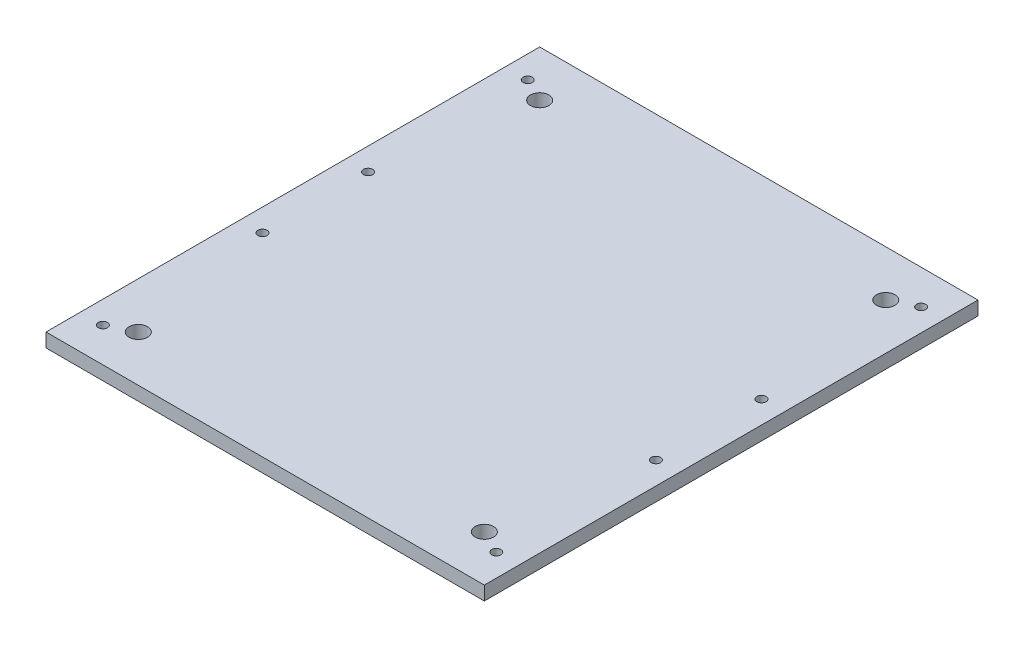
ISO-10303-21;
HEADER;
FILE_DESCRIPTION(('STEP AP214'),'2;1');
FILE_NAME('part.step','',(''),(''),'','','');
FILE_SCHEMA(('AUTOMOTIVE_DESIGN { 1 0 10303 214 1 1 1 1 }'));
ENDSEC;
DATA;
#1=APPLICATION_CONTEXT('core data for automotive mechanical design processes');
#2=APPLICATION_PROTOCOL_DEFINITION('international standard','automotive_design',2000,#1);
#3=PRODUCT_CONTEXT('',#1,'mechanical');
#4=PRODUCT('Part','Part','',(#3));
#5=PRODUCT_RELATED_PRODUCT_CATEGORY('part','',(#4));
#6=PRODUCT_DEFINITION_FORMATION('','',#4);
#7=PRODUCT_DEFINITION_CONTEXT('part definition',#1,'design');
#8=PRODUCT_DEFINITION('design','',#6,#7);
#9=PRODUCT_DEFINITION_SHAPE('','',#8);
#10=(LENGTH_UNIT() NAMED_UNIT(*) SI_UNIT(.MILLI.,.METRE.));
#11=(NAMED_UNIT(*) PLANE_ANGLE_UNIT() SI_UNIT($,.RADIAN.));
#12=(NAMED_UNIT(*) SI_UNIT($,.STERADIAN.) SOLID_ANGLE_UNIT());
#13=UNCERTAINTY_MEASURE_WITH_UNIT(LENGTH_MEASURE(1.E-05),#10,'distance_accuracy_value','');
#14=(GEOMETRIC_REPRESENTATION_CONTEXT(3) GLOBAL_UNCERTAINTY_ASSIGNED_CONTEXT((#13)) GLOBAL_UNIT_ASSIGNED_CONTEXT((#10,
#11,#12)) REPRESENTATION_CONTEXT('',''));
#15=CARTESIAN_POINT('',(0.,0.,0.));
#16=DIRECTION('',(0.,0.,1.));
#17=DIRECTION('',(1.,0.,0.));
#18=AXIS2_PLACEMENT_3D('',#15,#16,#17);
#19=CARTESIAN_POINT('',(0.,3.,53.5));
#20=DIRECTION('',(0.,0.,-1.));
#21=DIRECTION('',(-1.,0.,0.));
#22=AXIS2_PLACEMENT_3D('',#19,#20,#21);
#23=PLANE('',#22);
#24=DIRECTION('',(1.,0.,0.));
#25=VECTOR('',#24,1.);
#26=CARTESIAN_POINT('',(0.,0.,53.5));
#27=LINE('',#26,#25);
#28=CARTESIAN_POINT('',(-47.5,0.,53.5));
#29=VERTEX_POINT('',#28);
#30=CARTESIAN_POINT('',(47.5,0.,53.5));
#31=VERTEX_POINT('',#30);
#32=EDGE_CURVE('E132',#29,#31,#27,.T.);
#33=ORIENTED_EDGE('',*,*,#32,.T.);
#34=DIRECTION('',(0.,-1.,0.));
#35=VECTOR('',#34,1.);
#36=CARTESIAN_POINT('',(47.5,3.,53.5));
#37=LINE('',#36,#35);
#38=CARTESIAN_POINT('',(47.5,3.,53.5));
#39=VERTEX_POINT('',#38);
#40=EDGE_CURVE('E13',#39,#31,#37,.T.);
#41=ORIENTED_EDGE('',*,*,#40,.F.);
#42=DIRECTION('',(1.,0.,0.));
#43=VECTOR('',#42,1.);
#44=CARTESIAN_POINT('',(0.,3.,53.5));
#45=LINE('',#44,#43);
#46=CARTESIAN_POINT('',(-47.5,3.,53.5));
#47=VERTEX_POINT('',#46);
#48=EDGE_CURVE('E105',#47,#39,#45,.T.);
#49=ORIENTED_EDGE('',*,*,#48,.F.);
#50=DIRECTION('',(0.,-1.,0.));
#51=VECTOR('',#50,1.);
#52=CARTESIAN_POINT('',(-47.5,3.,53.5));
#53=LINE('',#52,#51);
#54=EDGE_CURVE('E71',#47,#29,#53,.T.);
#55=ORIENTED_EDGE('',*,*,#54,.T.);
#56=EDGE_LOOP('',(#33,#41,#49,#55));
#57=FACE_BOUND('',#56,.T.);
#58=ADVANCED_FACE('F53',(#57),#23,.F.);
#59=CARTESIAN_POINT('',(47.5,3.,0.));
#60=DIRECTION('',(-1.,0.,0.));
#61=DIRECTION('',(0.,0.,1.));
#62=AXIS2_PLACEMENT_3D('',#59,#60,#61);
#63=PLANE('',#62);
#64=DIRECTION('',(0.,0.,-1.));
#65=VECTOR('',#64,1.);
#66=CARTESIAN_POINT('',(47.5,0.,0.));
#67=LINE('',#66,#65);
#68=CARTESIAN_POINT('',(47.5,0.,-53.5));
#69=VERTEX_POINT('',#68);
#70=EDGE_CURVE('E110',#31,#69,#67,.T.);
#71=ORIENTED_EDGE('',*,*,#70,.T.);
#72=DIRECTION('',(0.,-1.,0.));
#73=VECTOR('',#72,1.);
#74=CARTESIAN_POINT('',(47.5,3.,-53.5));
#75=LINE('',#74,#73);
#76=CARTESIAN_POINT('',(47.5,3.,-53.5));
#77=VERTEX_POINT('',#76);
#78=EDGE_CURVE('E62',#77,#69,#75,.T.);
#79=ORIENTED_EDGE('',*,*,#78,.F.);
#80=DIRECTION('',(0.,0.,-1.));
#81=VECTOR('',#80,1.);
#82=CARTESIAN_POINT('',(47.5,3.,0.));
#83=LINE('',#82,#81);
#84=EDGE_CURVE('E96',#39,#77,#83,.T.);
#85=ORIENTED_EDGE('',*,*,#84,.F.);
#86=ORIENTED_EDGE('',*,*,#40,.T.);
#87=EDGE_LOOP('',(#71,#79,#85,#86));
#88=FACE_BOUND('',#87,.T.);
#89=ADVANCED_FACE('F109',(#88),#63,.F.);
#90=CARTESIAN_POINT('',(0.,3.,-53.5));
#91=DIRECTION('',(0.,0.,-1.));
#92=DIRECTION('',(-1.,0.,0.));
#93=AXIS2_PLACEMENT_3D('',#90,#91,#92);
#94=PLANE('',#93);
#95=DIRECTION('',(1.,0.,0.));
#96=VECTOR('',#95,1.);
#97=CARTESIAN_POINT('',(0.,0.,-53.5));
#98=LINE('',#97,#96);
#99=CARTESIAN_POINT('',(-47.5,0.,-53.5));
#100=VERTEX_POINT('',#99);
#101=EDGE_CURVE('E136',#100,#69,#98,.T.);
#102=ORIENTED_EDGE('',*,*,#101,.F.);
#103=DIRECTION('',(0.,-1.,0.));
#104=VECTOR('',#103,1.);
#105=CARTESIAN_POINT('',(-47.5,3.,-53.5));
#106=LINE('',#105,#104);
#107=CARTESIAN_POINT('',(-47.5,3.,-53.5));
#108=VERTEX_POINT('',#107);
#109=EDGE_CURVE('E85',#108,#100,#106,.T.);
#110=ORIENTED_EDGE('',*,*,#109,.F.);
#111=DIRECTION('',(1.,0.,0.));
#112=VECTOR('',#111,1.);
#113=CARTESIAN_POINT('',(0.,3.,-53.5));
#114=LINE('',#113,#112);
#115=EDGE_CURVE('E104',#108,#77,#114,.T.);
#116=ORIENTED_EDGE('',*,*,#115,.T.);
#117=ORIENTED_EDGE('',*,*,#78,.T.);
#118=EDGE_LOOP('',(#102,#110,#116,#117));
#119=FACE_BOUND('',#118,.T.);
#120=ADVANCED_FACE('F114',(#119),#94,.T.);
#121=CARTESIAN_POINT('',(37.5,3.,43.5));
#122=DIRECTION('',(0.,-1.,0.));
#123=DIRECTION('',(0.,0.,-1.));
#124=AXIS2_PLACEMENT_3D('',#121,#122,#123);
#125=CYLINDRICAL_SURFACE('',#124,2.);
#126=CARTESIAN_POINT('',(37.5,3.,43.5));
#127=DIRECTION('',(0.,1.,0.));
#128=DIRECTION('',(0.,0.,1.));
#129=AXIS2_PLACEMENT_3D('',#126,#127,#128);
#130=CIRCLE('',#129,2.);
#131=CARTESIAN_POINT('',(37.5,3.,45.5));
#132=VERTEX_POINT('',#131);
#133=EDGE_CURVE('E126',#132,#132,#130,.T.);
#134=ORIENTED_EDGE('',*,*,#133,.T.);
#135=EDGE_LOOP('',(#134));
#136=FACE_BOUND('',#135,.T.);
#137=CARTESIAN_POINT('',(37.5,0.,43.5));
#138=DIRECTION('',(0.,1.,0.));
#139=DIRECTION('',(0.,0.,1.));
#140=AXIS2_PLACEMENT_3D('',#137,#138,#139);
#141=CIRCLE('',#140,2.);
#142=CARTESIAN_POINT('',(37.5,0.,45.5));
#143=VERTEX_POINT('',#142);
#144=EDGE_CURVE('E147',#143,#143,#141,.T.);
#145=ORIENTED_EDGE('',*,*,#144,.F.);
#146=EDGE_LOOP('',(#145));
#147=FACE_BOUND('',#146,.T.);
#148=ADVANCED_FACE('F241',(#136,#147),#125,.F.);
#149=CARTESIAN_POINT('',(37.5,3.,-43.5));
#150=DIRECTION('',(0.,-1.,0.));
#151=DIRECTION('',(0.,0.,-1.));
#152=AXIS2_PLACEMENT_3D('',#149,#150,#151);
#153=CYLINDRICAL_SURFACE('',#152,2.);
#154=CARTESIAN_POINT('',(37.5,3.,-43.5));
#155=DIRECTION('',(0.,1.,0.));
#156=DIRECTION('',(0.,0.,1.));
#157=AXIS2_PLACEMENT_3D('',#154,#155,#156);
#158=CIRCLE('',#157,2.);
#159=CARTESIAN_POINT('',(37.5,3.,-41.5));
#160=VERTEX_POINT('',#159);
#161=EDGE_CURVE('E123',#160,#160,#158,.F.);
#162=ORIENTED_EDGE('',*,*,#161,.F.);
#163=EDGE_LOOP('',(#162));
#164=FACE_BOUND('',#163,.T.);
#165=CARTESIAN_POINT('',(37.5,0.,-43.5));
#166=DIRECTION('',(0.,1.,0.));
#167=DIRECTION('',(0.,0.,1.));
#168=AXIS2_PLACEMENT_3D('',#165,#166,#167);
#169=CIRCLE('',#168,2.);
#170=CARTESIAN_POINT('',(37.5,0.,-41.5));
#171=VERTEX_POINT('',#170);
#172=EDGE_CURVE('E144',#171,#171,#169,.F.);
#173=ORIENTED_EDGE('',*,*,#172,.T.);
#174=EDGE_LOOP('',(#173));
#175=FACE_BOUND('',#174,.T.);
#176=ADVANCED_FACE('F235',(#164,#175),#153,.F.);
#177=CARTESIAN_POINT('',(-37.5,3.,-43.5));
#178=DIRECTION('',(0.,-1.,0.));
#179=DIRECTION('',(0.,0.,-1.));
#180=AXIS2_PLACEMENT_3D('',#177,#178,#179);
#181=CYLINDRICAL_SURFACE('',#180,2.);
#182=CARTESIAN_POINT('',(-37.5,3.,-43.5));
#183=DIRECTION('',(0.,1.,0.));
#184=DIRECTION('',(0.,0.,1.));
#185=AXIS2_PLACEMENT_3D('',#182,#183,#184);
#186=CIRCLE('',#185,2.);
#187=CARTESIAN_POINT('',(-37.5,3.,-41.5));
#188=VERTEX_POINT('',#187);
#189=EDGE_CURVE('E117',#188,#188,#186,.T.);
#190=ORIENTED_EDGE('',*,*,#189,.T.);
#191=EDGE_LOOP('',(#190));
#192=FACE_BOUND('',#191,.T.);
#193=CARTESIAN_POINT('',(-37.5,0.,-43.5));
#194=DIRECTION('',(0.,1.,0.));
#195=DIRECTION('',(0.,0.,1.));
#196=AXIS2_PLACEMENT_3D('',#193,#194,#195);
#197=CIRCLE('',#196,2.);
#198=CARTESIAN_POINT('',(-37.5,0.,-41.5));
#199=VERTEX_POINT('',#198);
#200=EDGE_CURVE('E141',#199,#199,#197,.T.);
#201=ORIENTED_EDGE('',*,*,#200,.F.);
#202=EDGE_LOOP('',(#201));
#203=FACE_BOUND('',#202,.T.);
#204=ADVANCED_FACE('F230',(#192,#203),#181,.F.);
#205=CARTESIAN_POINT('',(-47.5,3.,0.));
#206=DIRECTION('',(-1.,0.,0.));
#207=DIRECTION('',(0.,0.,1.));
#208=AXIS2_PLACEMENT_3D('',#205,#206,#207);
#209=PLANE('',#208);
#210=DIRECTION('',(0.,0.,-1.));
#211=VECTOR('',#210,1.);
#212=CARTESIAN_POINT('',(-47.5,0.,0.));
#213=LINE('',#212,#211);
#214=EDGE_CURVE('E138',#29,#100,#213,.T.);
#215=ORIENTED_EDGE('',*,*,#214,.F.);
#216=ORIENTED_EDGE('',*,*,#54,.F.);
#217=DIRECTION('',(0.,0.,-1.));
#218=VECTOR('',#217,1.);
#219=CARTESIAN_POINT('',(-47.5,3.,0.));
#220=LINE('',#219,#218);
#221=EDGE_CURVE('E115',#47,#108,#220,.T.);
#222=ORIENTED_EDGE('',*,*,#221,.T.);
#223=ORIENTED_EDGE('',*,*,#109,.T.);
#224=EDGE_LOOP('',(#215,#216,#222,#223));
#225=FACE_BOUND('',#224,.T.);
#226=ADVANCED_FACE('F217',(#225),#209,.T.);
#227=CARTESIAN_POINT('',(-37.5,3.,43.5));
#228=DIRECTION('',(0.,-1.,0.));
#229=DIRECTION('',(0.,0.,-1.));
#230=AXIS2_PLACEMENT_3D('',#227,#228,#229);
#231=CYLINDRICAL_SURFACE('',#230,2.);
#232=CARTESIAN_POINT('',(-37.5,3.,43.5));
#233=DIRECTION('',(0.,1.,0.));
#234=DIRECTION('',(0.,0.,1.));
#235=AXIS2_PLACEMENT_3D('',#232,#233,#234);
#236=CIRCLE('',#235,2.);
#237=CARTESIAN_POINT('',(-37.5,3.,45.5));
#238=VERTEX_POINT('',#237);
#239=EDGE_CURVE('E129',#238,#238,#236,.F.);
#240=ORIENTED_EDGE('',*,*,#239,.F.);
#241=EDGE_LOOP('',(#240));
#242=FACE_BOUND('',#241,.T.);
#243=CARTESIAN_POINT('',(-37.5,0.,43.5));
#244=DIRECTION('',(0.,1.,0.));
#245=DIRECTION('',(0.,0.,1.));
#246=AXIS2_PLACEMENT_3D('',#243,#244,#245);
#247=CIRCLE('',#246,2.);
#248=CARTESIAN_POINT('',(-37.5,0.,45.5));
#249=VERTEX_POINT('',#248);
#250=EDGE_CURVE('E150',#249,#249,#247,.F.);
#251=ORIENTED_EDGE('',*,*,#250,.T.);
#252=EDGE_LOOP('',(#251));
#253=FACE_BOUND('',#252,.T.);
#254=ADVANCED_FACE('F208',(#242,#253),#231,.F.);
#255=CARTESIAN_POINT('',(0.,3.,0.));
#256=DIRECTION('',(0.,1.,0.));
#257=DIRECTION('',(0.,0.,1.));
#258=AXIS2_PLACEMENT_3D('',#255,#256,#257);
#259=PLANE('',#258);
#260=CARTESIAN_POINT('',(-42.63,3.,11.4372225515878));
#261=DIRECTION('',(0.,-1.,0.));
#262=DIRECTION('',(0.,0.,1.));
#263=AXIS2_PLACEMENT_3D('',#260,#261,#262);
#264=CIRCLE('',#263,0.999999999999998);
#265=CARTESIAN_POINT('',(-42.63,3.,12.4372225515878));
#266=VERTEX_POINT('',#265);
#267=EDGE_CURVE('E189',#266,#266,#264,.T.);
#268=ORIENTED_EDGE('',*,*,#267,.T.);
#269=EDGE_LOOP('',(#268));
#270=FACE_BOUND('',#269,.T.);
#271=CARTESIAN_POINT('',(-42.63,3.,-11.4372225515878));
#272=DIRECTION('',(0.,1.,0.));
#273=DIRECTION('',(0.,0.,-1.));
#274=AXIS2_PLACEMENT_3D('',#271,#272,#273);
#275=CIRCLE('',#274,0.999999999999998);
#276=CARTESIAN_POINT('',(-42.63,3.,-12.4372225515878));
#277=VERTEX_POINT('',#276);
#278=EDGE_CURVE('E179',#277,#277,#275,.T.);
#279=ORIENTED_EDGE('',*,*,#278,.F.);
#280=EDGE_LOOP('',(#279));
#281=FACE_BOUND('',#280,.T.);
#282=CARTESIAN_POINT('',(42.63,3.,11.4372225515878));
#283=DIRECTION('',(0.,1.,0.));
#284=DIRECTION('',(0.,0.,1.));
#285=AXIS2_PLACEMENT_3D('',#282,#283,#284);
#286=CIRCLE('',#285,0.999999999999998);
#287=CARTESIAN_POINT('',(42.63,3.,12.4372225515878));
#288=VERTEX_POINT('',#287);
#289=EDGE_CURVE('E176',#288,#288,#286,.T.);
#290=ORIENTED_EDGE('',*,*,#289,.F.);
#291=EDGE_LOOP('',(#290));
#292=FACE_BOUND('',#291,.T.);
#293=CARTESIAN_POINT('',(-42.63,3.,46.04));
#294=DIRECTION('',(0.,1.,0.));
#295=DIRECTION('',(0.,0.,-1.));
#296=AXIS2_PLACEMENT_3D('',#293,#294,#295);
#297=CIRCLE('',#296,0.999999999999998);
#298=CARTESIAN_POINT('',(-42.63,3.,45.04));
#299=VERTEX_POINT('',#298);
#300=EDGE_CURVE('E173',#299,#299,#297,.T.);
#301=ORIENTED_EDGE('',*,*,#300,.F.);
#302=EDGE_LOOP('',(#301));
#303=FACE_BOUND('',#302,.T.);
#304=CARTESIAN_POINT('',(-42.63,3.,-46.04));
#305=DIRECTION('',(0.,-1.,0.));
#306=DIRECTION('',(0.,0.,1.));
#307=AXIS2_PLACEMENT_3D('',#304,#305,#306);
#308=CIRCLE('',#307,0.999999999999998);
#309=CARTESIAN_POINT('',(-42.63,3.,-45.04));
#310=VERTEX_POINT('',#309);
#311=EDGE_CURVE('E169',#310,#310,#308,.T.);
#312=ORIENTED_EDGE('',*,*,#311,.T.);
#313=EDGE_LOOP('',(#312));
#314=FACE_BOUND('',#313,.T.);
#315=CARTESIAN_POINT('',(42.63,3.,46.04));
#316=DIRECTION('',(0.,-1.,0.));
#317=DIRECTION('',(0.,0.,-1.));
#318=AXIS2_PLACEMENT_3D('',#315,#316,#317);
#319=CIRCLE('',#318,0.999999999999998);
#320=CARTESIAN_POINT('',(42.63,3.,45.04));
#321=VERTEX_POINT('',#320);
#322=EDGE_CURVE('E165',#321,#321,#319,.T.);
#323=ORIENTED_EDGE('',*,*,#322,.T.);
#324=EDGE_LOOP('',(#323));
#325=FACE_BOUND('',#324,.T.);
#326=CARTESIAN_POINT('',(42.63,3.,-11.4372225515878));
#327=DIRECTION('',(0.,-1.,0.));
#328=DIRECTION('',(0.,0.,-1.));
#329=AXIS2_PLACEMENT_3D('',#326,#327,#328);
#330=CIRCLE('',#329,0.999999999999998);
#331=CARTESIAN_POINT('',(42.63,3.,-12.4372225515878));
#332=VERTEX_POINT('',#331);
#333=EDGE_CURVE('E161',#332,#332,#330,.T.);
#334=ORIENTED_EDGE('',*,*,#333,.T.);
#335=EDGE_LOOP('',(#334));
#336=FACE_BOUND('',#335,.T.);
#337=CARTESIAN_POINT('',(42.63,3.,-46.04));
#338=DIRECTION('',(0.,1.,0.));
#339=DIRECTION('',(0.,0.,1.));
#340=AXIS2_PLACEMENT_3D('',#337,#338,#339);
#341=CIRCLE('',#340,0.999999999999998);
#342=CARTESIAN_POINT('',(42.63,3.,-45.04));
#343=VERTEX_POINT('',#342);
#344=EDGE_CURVE('E157',#343,#343,#341,.T.);
#345=ORIENTED_EDGE('',*,*,#344,.F.);
#346=EDGE_LOOP('',(#345));
#347=FACE_BOUND('',#346,.T.);
#348=ORIENTED_EDGE('',*,*,#48,.T.);
#349=ORIENTED_EDGE('',*,*,#84,.T.);
#350=ORIENTED_EDGE('',*,*,#115,.F.);
#351=ORIENTED_EDGE('',*,*,#221,.F.);
#352=EDGE_LOOP('',(#348,#349,#350,#351));
#353=FACE_BOUND('',#352,.T.);
#354=ORIENTED_EDGE('',*,*,#189,.F.);
#355=EDGE_LOOP('',(#354));
#356=FACE_BOUND('',#355,.T.);
#357=ORIENTED_EDGE('',*,*,#161,.T.);
#358=EDGE_LOOP('',(#357));
#359=FACE_BOUND('',#358,.T.);
#360=ORIENTED_EDGE('',*,*,#133,.F.);
#361=EDGE_LOOP('',(#360));
#362=FACE_BOUND('',#361,.T.);
#363=ORIENTED_EDGE('',*,*,#239,.T.);
#364=EDGE_LOOP('',(#363));
#365=FACE_BOUND('',#364,.T.);
#366=ADVANCED_FACE('F100',(#270,#281,#292,#303,#314,#325,#336,#347,#353,#356,#359,#362,#365),
#259,.T.);
#367=CARTESIAN_POINT('',(0.,0.,0.));
#368=DIRECTION('',(0.,1.,0.));
#369=DIRECTION('',(0.,0.,1.));
#370=AXIS2_PLACEMENT_3D('',#367,#368,#369);
#371=PLANE('',#370);
#372=CARTESIAN_POINT('',(-42.63,0.,11.4372225515878));
#373=DIRECTION('',(0.,1.,0.));
#374=DIRECTION('',(0.,0.,1.));
#375=AXIS2_PLACEMENT_3D('',#372,#373,#374);
#376=CIRCLE('',#375,0.999999999999998);
#377=CARTESIAN_POINT('',(-42.63,0.,12.4372225515878));
#378=VERTEX_POINT('',#377);
#379=EDGE_CURVE('E56',#378,#378,#376,.F.);
#380=ORIENTED_EDGE('',*,*,#379,.F.);
#381=EDGE_LOOP('',(#380));
#382=FACE_BOUND('',#381,.T.);
#383=CARTESIAN_POINT('',(-42.63,0.,-11.4372225515878));
#384=DIRECTION('',(0.,1.,0.));
#385=DIRECTION('',(0.,0.,1.));
#386=AXIS2_PLACEMENT_3D('',#383,#384,#385);
#387=CIRCLE('',#386,0.999999999999998);
#388=CARTESIAN_POINT('',(-42.63,0.,-10.4372225515878));
#389=VERTEX_POINT('',#388);
#390=EDGE_CURVE('E177',#389,#389,#387,.T.);
#391=ORIENTED_EDGE('',*,*,#390,.T.);
#392=EDGE_LOOP('',(#391));
#393=FACE_BOUND('',#392,.T.);
#394=CARTESIAN_POINT('',(42.63,0.,11.4372225515878));
#395=DIRECTION('',(0.,1.,0.));
#396=DIRECTION('',(0.,0.,1.));
#397=AXIS2_PLACEMENT_3D('',#394,#395,#396);
#398=CIRCLE('',#397,0.999999999999998);
#399=CARTESIAN_POINT('',(42.63,0.,12.4372225515878));
#400=VERTEX_POINT('',#399);
#401=EDGE_CURVE('E174',#400,#400,#398,.T.);
#402=ORIENTED_EDGE('',*,*,#401,.T.);
#403=EDGE_LOOP('',(#402));
#404=FACE_BOUND('',#403,.T.);
#405=CARTESIAN_POINT('',(-42.63,0.,46.04));
#406=DIRECTION('',(0.,1.,0.));
#407=DIRECTION('',(0.,0.,1.));
#408=AXIS2_PLACEMENT_3D('',#405,#406,#407);
#409=CIRCLE('',#408,0.999999999999998);
#410=CARTESIAN_POINT('',(-42.63,0.,47.04));
#411=VERTEX_POINT('',#410);
#412=EDGE_CURVE('E170',#411,#411,#409,.T.);
#413=ORIENTED_EDGE('',*,*,#412,.T.);
#414=EDGE_LOOP('',(#413));
#415=FACE_BOUND('',#414,.T.);
#416=CARTESIAN_POINT('',(-42.63,0.,-46.04));
#417=DIRECTION('',(0.,1.,0.));
#418=DIRECTION('',(0.,0.,1.));
#419=AXIS2_PLACEMENT_3D('',#416,#417,#418);
#420=CIRCLE('',#419,0.999999999999998);
#421=CARTESIAN_POINT('',(-42.63,0.,-45.04));
#422=VERTEX_POINT('',#421);
#423=EDGE_CURVE('E166',#422,#422,#420,.F.);
#424=ORIENTED_EDGE('',*,*,#423,.F.);
#425=EDGE_LOOP('',(#424));
#426=FACE_BOUND('',#425,.T.);
#427=CARTESIAN_POINT('',(42.63,0.,46.04));
#428=DIRECTION('',(0.,1.,0.));
#429=DIRECTION('',(0.,0.,1.));
#430=AXIS2_PLACEMENT_3D('',#427,#428,#429);
#431=CIRCLE('',#430,0.999999999999998);
#432=CARTESIAN_POINT('',(42.63,0.,47.04));
#433=VERTEX_POINT('',#432);
#434=EDGE_CURVE('E162',#433,#433,#431,.F.);
#435=ORIENTED_EDGE('',*,*,#434,.F.);
#436=EDGE_LOOP('',(#435));
#437=FACE_BOUND('',#436,.T.);
#438=CARTESIAN_POINT('',(42.63,0.,-11.4372225515878));
#439=DIRECTION('',(0.,1.,0.));
#440=DIRECTION('',(0.,0.,1.));
#441=AXIS2_PLACEMENT_3D('',#438,#439,#440);
#442=CIRCLE('',#441,0.999999999999998);
#443=CARTESIAN_POINT('',(42.63,0.,-10.4372225515878));
#444=VERTEX_POINT('',#443);
#445=EDGE_CURVE('E158',#444,#444,#442,.F.);
#446=ORIENTED_EDGE('',*,*,#445,.F.);
#447=EDGE_LOOP('',(#446));
#448=FACE_BOUND('',#447,.T.);
#449=CARTESIAN_POINT('',(42.63,0.,-46.04));
#450=DIRECTION('',(0.,1.,0.));
#451=DIRECTION('',(0.,0.,1.));
#452=AXIS2_PLACEMENT_3D('',#449,#450,#451);
#453=CIRCLE('',#452,0.999999999999998);
#454=CARTESIAN_POINT('',(42.63,0.,-45.04));
#455=VERTEX_POINT('',#454);
#456=EDGE_CURVE('E134',#455,#455,#453,.T.);
#457=ORIENTED_EDGE('',*,*,#456,.T.);
#458=EDGE_LOOP('',(#457));
#459=FACE_BOUND('',#458,.T.);
#460=ORIENTED_EDGE('',*,*,#32,.F.);
#461=ORIENTED_EDGE('',*,*,#214,.T.);
#462=ORIENTED_EDGE('',*,*,#101,.T.);
#463=ORIENTED_EDGE('',*,*,#70,.F.);
#464=EDGE_LOOP('',(#460,#461,#462,#463));
#465=FACE_BOUND('',#464,.T.);
#466=ORIENTED_EDGE('',*,*,#200,.T.);
#467=EDGE_LOOP('',(#466));
#468=FACE_BOUND('',#467,.T.);
#469=ORIENTED_EDGE('',*,*,#172,.F.);
#470=EDGE_LOOP('',(#469));
#471=FACE_BOUND('',#470,.T.);
#472=ORIENTED_EDGE('',*,*,#144,.T.);
#473=EDGE_LOOP('',(#472));
#474=FACE_BOUND('',#473,.T.);
#475=ORIENTED_EDGE('',*,*,#250,.F.);
#476=EDGE_LOOP('',(#475));
#477=FACE_BOUND('',#476,.T.);
#478=ADVANCED_FACE('F207',(#382,#393,#404,#415,#426,#437,#448,#459,#465,#468,#471,#474,#477),
#371,.F.);
#479=CARTESIAN_POINT('',(42.63,-7.,-46.04));
#480=DIRECTION('',(0.,1.,0.));
#481=DIRECTION('',(0.,0.,1.));
#482=AXIS2_PLACEMENT_3D('',#479,#480,#481);
#483=CYLINDRICAL_SURFACE('',#482,0.999999999999998);
#484=ORIENTED_EDGE('',*,*,#344,.T.);
#485=EDGE_LOOP('',(#484));
#486=FACE_BOUND('',#485,.T.);
#487=ORIENTED_EDGE('',*,*,#456,.F.);
#488=EDGE_LOOP('',(#487));
#489=FACE_BOUND('',#488,.T.);
#490=ADVANCED_FACE('F203',(#486,#489),#483,.F.);
#491=CARTESIAN_POINT('',(42.63,-7.,-11.4372225515878));
#492=DIRECTION('',(0.,1.,0.));
#493=DIRECTION('',(0.,0.,1.));
#494=AXIS2_PLACEMENT_3D('',#491,#492,#493);
#495=CYLINDRICAL_SURFACE('',#494,0.999999999999998);
#496=ORIENTED_EDGE('',*,*,#333,.F.);
#497=EDGE_LOOP('',(#496));
#498=FACE_BOUND('',#497,.T.);
#499=ORIENTED_EDGE('',*,*,#445,.T.);
#500=EDGE_LOOP('',(#499));
#501=FACE_BOUND('',#500,.T.);
#502=ADVANCED_FACE('F292',(#498,#501),#495,.F.);
#503=CARTESIAN_POINT('',(42.63,-7.,46.04));
#504=DIRECTION('',(0.,1.,0.));
#505=DIRECTION('',(0.,0.,1.));
#506=AXIS2_PLACEMENT_3D('',#503,#504,#505);
#507=CYLINDRICAL_SURFACE('',#506,0.999999999999998);
#508=ORIENTED_EDGE('',*,*,#322,.F.);
#509=EDGE_LOOP('',(#508));
#510=FACE_BOUND('',#509,.T.);
#511=ORIENTED_EDGE('',*,*,#434,.T.);
#512=EDGE_LOOP('',(#511));
#513=FACE_BOUND('',#512,.T.);
#514=ADVANCED_FACE('F300',(#510,#513),#507,.F.);
#515=CARTESIAN_POINT('',(-42.63,-7.,-46.04));
#516=DIRECTION('',(0.,1.,0.));
#517=DIRECTION('',(0.,0.,1.));
#518=AXIS2_PLACEMENT_3D('',#515,#516,#517);
#519=CYLINDRICAL_SURFACE('',#518,0.999999999999998);
#520=ORIENTED_EDGE('',*,*,#311,.F.);
#521=EDGE_LOOP('',(#520));
#522=FACE_BOUND('',#521,.T.);
#523=ORIENTED_EDGE('',*,*,#423,.T.);
#524=EDGE_LOOP('',(#523));
#525=FACE_BOUND('',#524,.T.);
#526=ADVANCED_FACE('F321',(#522,#525),#519,.F.);
#527=CARTESIAN_POINT('',(-42.63,-7.,46.04));
#528=DIRECTION('',(0.,1.,0.));
#529=DIRECTION('',(0.,0.,1.));
#530=AXIS2_PLACEMENT_3D('',#527,#528,#529);
#531=CYLINDRICAL_SURFACE('',#530,0.999999999999998);
#532=ORIENTED_EDGE('',*,*,#300,.T.);
#533=EDGE_LOOP('',(#532));
#534=FACE_BOUND('',#533,.T.);
#535=ORIENTED_EDGE('',*,*,#412,.F.);
#536=EDGE_LOOP('',(#535));
#537=FACE_BOUND('',#536,.T.);
#538=ADVANCED_FACE('F331',(#534,#537),#531,.F.);
#539=CARTESIAN_POINT('',(42.63,-7.,11.4372225515878));
#540=DIRECTION('',(0.,1.,0.));
#541=DIRECTION('',(0.,0.,1.));
#542=AXIS2_PLACEMENT_3D('',#539,#540,#541);
#543=CYLINDRICAL_SURFACE('',#542,0.999999999999998);
#544=ORIENTED_EDGE('',*,*,#289,.T.);
#545=EDGE_LOOP('',(#544));
#546=FACE_BOUND('',#545,.T.);
#547=ORIENTED_EDGE('',*,*,#401,.F.);
#548=EDGE_LOOP('',(#547));
#549=FACE_BOUND('',#548,.T.);
#550=ADVANCED_FACE('F341',(#546,#549),#543,.F.);
#551=CARTESIAN_POINT('',(-42.63,-7.,-11.4372225515878));
#552=DIRECTION('',(0.,1.,0.));
#553=DIRECTION('',(0.,0.,1.));
#554=AXIS2_PLACEMENT_3D('',#551,#552,#553);
#555=CYLINDRICAL_SURFACE('',#554,0.999999999999998);
#556=ORIENTED_EDGE('',*,*,#278,.T.);
#557=EDGE_LOOP('',(#556));
#558=FACE_BOUND('',#557,.T.);
#559=ORIENTED_EDGE('',*,*,#390,.F.);
#560=EDGE_LOOP('',(#559));
#561=FACE_BOUND('',#560,.T.);
#562=ADVANCED_FACE('F351',(#558,#561),#555,.F.);
#563=CARTESIAN_POINT('',(-42.63,-7.,11.4372225515878));
#564=DIRECTION('',(0.,1.,0.));
#565=DIRECTION('',(0.,0.,1.));
#566=AXIS2_PLACEMENT_3D('',#563,#564,#565);
#567=CYLINDRICAL_SURFACE('',#566,0.999999999999998);
#568=ORIENTED_EDGE('',*,*,#267,.F.);
#569=EDGE_LOOP('',(#568));
#570=FACE_BOUND('',#569,.T.);
#571=ORIENTED_EDGE('',*,*,#379,.T.);
#572=EDGE_LOOP('',(#571));
#573=FACE_BOUND('',#572,.T.);
#574=ADVANCED_FACE('F361',(#570,#573),#567,.F.);
#575=CLOSED_SHELL('',(#58,#89,#120,#148,#176,#204,#226,#254,#366,#478,#490,#502,#514,#526,#538,
#550,#562,#574));
#576=MANIFOLD_SOLID_BREP('B2',#575);
#577=ADVANCED_BREP_SHAPE_REPRESENTATION('',(#18,#576),#14);
#578=SHAPE_DEFINITION_REPRESENTATION(#9,#577);
ENDSEC;
END-ISO-10303-21;
